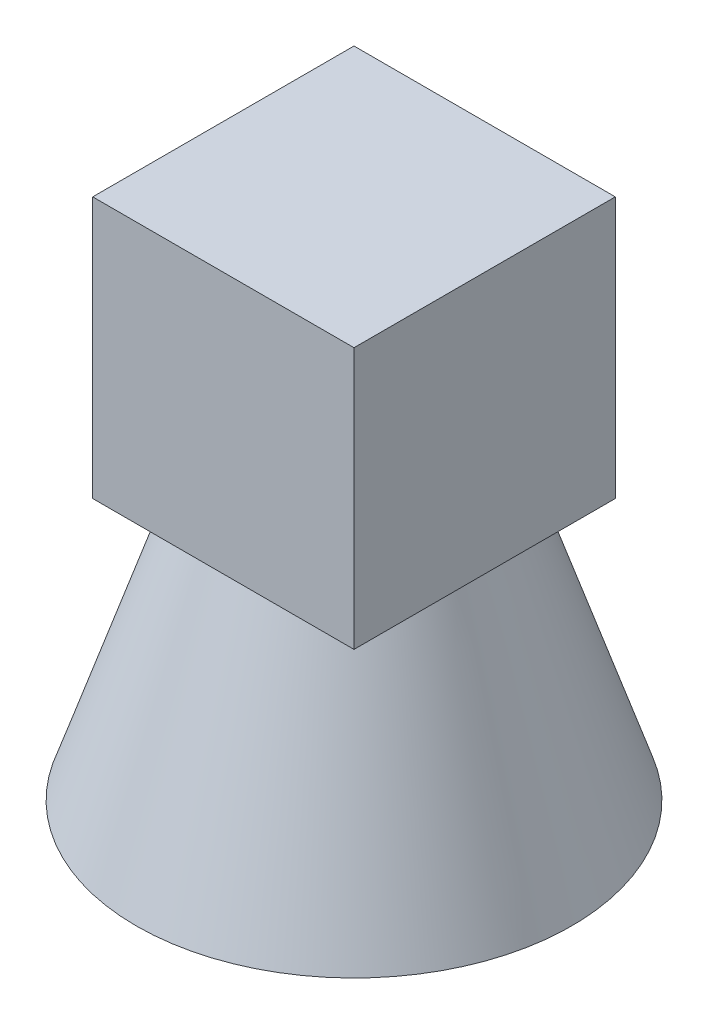
ISO-10303-21;
HEADER;
FILE_DESCRIPTION(('STEP AP214'),'2;1');
FILE_NAME('part.step','',(''),(''),'','','');
FILE_SCHEMA(('AUTOMOTIVE_DESIGN { 1 0 10303 214 1 1 1 1 }'));
ENDSEC;
DATA;
#1=APPLICATION_CONTEXT('core data for automotive mechanical design processes');
#2=APPLICATION_PROTOCOL_DEFINITION('international standard','automotive_design',2000,#1);
#3=PRODUCT_CONTEXT('',#1,'mechanical');
#4=PRODUCT('Part','Part','',(#3));
#5=PRODUCT_RELATED_PRODUCT_CATEGORY('part','',(#4));
#6=PRODUCT_DEFINITION_FORMATION('','',#4);
#7=PRODUCT_DEFINITION_CONTEXT('part definition',#1,'design');
#8=PRODUCT_DEFINITION('design','',#6,#7);
#9=PRODUCT_DEFINITION_SHAPE('','',#8);
#10=(LENGTH_UNIT() NAMED_UNIT(*) SI_UNIT(.MILLI.,.METRE.));
#11=(NAMED_UNIT(*) PLANE_ANGLE_UNIT() SI_UNIT($,.RADIAN.));
#12=(NAMED_UNIT(*) SI_UNIT($,.STERADIAN.) SOLID_ANGLE_UNIT());
#13=UNCERTAINTY_MEASURE_WITH_UNIT(LENGTH_MEASURE(1.E-05),#10,'distance_accuracy_value','');
#14=(GEOMETRIC_REPRESENTATION_CONTEXT(3) GLOBAL_UNCERTAINTY_ASSIGNED_CONTEXT((#13)) GLOBAL_UNIT_ASSIGNED_CONTEXT((#10,
#11,#12)) REPRESENTATION_CONTEXT('',''));
#15=CARTESIAN_POINT('',(0.,0.,0.));
#16=DIRECTION('',(0.,0.,1.));
#17=DIRECTION('',(1.,0.,0.));
#18=AXIS2_PLACEMENT_3D('',#15,#16,#17);
#19=CARTESIAN_POINT('',(0.,0.,0.));
#20=DIRECTION('',(0.,-1.,0.));
#21=DIRECTION('',(0.,0.,-1.));
#22=AXIS2_PLACEMENT_3D('',#19,#20,#21);
#23=PLANE('',#22);
#24=CARTESIAN_POINT('',(0.,0.,0.));
#25=DIRECTION('',(0.,-1.,0.));
#26=DIRECTION('',(0.,0.,-1.));
#27=AXIS2_PLACEMENT_3D('',#24,#25,#26);
#28=CIRCLE('',#27,15.);
#29=CARTESIAN_POINT('',(0.,0.,-15.));
#30=VERTEX_POINT('',#29);
#31=CARTESIAN_POINT('',(15.,0.,0.));
#32=VERTEX_POINT('',#31);
#33=EDGE_CURVE('E55',#30,#32,#28,.T.);
#34=ORIENTED_EDGE('',*,*,#33,.F.);
#35=DIRECTION('',(-1.,0.,0.));
#36=VECTOR('',#35,1.);
#37=CARTESIAN_POINT('',(-15.,0.,-15.));
#38=LINE('',#37,#36);
#39=CARTESIAN_POINT('',(15.,0.,-15.));
#40=VERTEX_POINT('',#39);
#41=EDGE_CURVE('E102',#40,#30,#38,.T.);
#42=ORIENTED_EDGE('',*,*,#41,.F.);
#43=DIRECTION('',(0.,0.,-1.));
#44=VECTOR('',#43,1.);
#45=CARTESIAN_POINT('',(15.,0.,15.));
#46=LINE('',#45,#44);
#47=EDGE_CURVE('E120',#32,#40,#46,.T.);
#48=ORIENTED_EDGE('',*,*,#47,.F.);
#49=EDGE_LOOP('',(#34,#42,#48));
#50=FACE_BOUND('',#49,.T.);
#51=ADVANCED_FACE('F43',(#50),#23,.T.);
#52=CARTESIAN_POINT('',(0.,0.,15.));
#53=VERTEX_POINT('',#52);
#54=EDGE_CURVE('E11',#32,#53,#28,.T.);
#55=ORIENTED_EDGE('',*,*,#54,.F.);
#56=CARTESIAN_POINT('',(15.,0.,15.));
#57=VERTEX_POINT('',#56);
#58=EDGE_CURVE('E118',#57,#32,#46,.T.);
#59=ORIENTED_EDGE('',*,*,#58,.F.);
#60=DIRECTION('',(1.,0.,0.));
#61=VECTOR('',#60,1.);
#62=CARTESIAN_POINT('',(-15.,0.,15.));
#63=LINE('',#62,#61);
#64=EDGE_CURVE('E152',#53,#57,#63,.T.);
#65=ORIENTED_EDGE('',*,*,#64,.F.);
#66=EDGE_LOOP('',(#55,#59,#65));
#67=FACE_BOUND('',#66,.T.);
#68=ADVANCED_FACE('F191',(#67),#23,.T.);
#69=CARTESIAN_POINT('',(-15.,0.,0.));
#70=VERTEX_POINT('',#69);
#71=EDGE_CURVE('E53',#53,#70,#28,.T.);
#72=ORIENTED_EDGE('',*,*,#71,.F.);
#73=CARTESIAN_POINT('',(-15.,0.,15.));
#74=VERTEX_POINT('',#73);
#75=EDGE_CURVE('E138',#74,#53,#63,.T.);
#76=ORIENTED_EDGE('',*,*,#75,.F.);
#77=DIRECTION('',(0.,0.,1.));
#78=VECTOR('',#77,1.);
#79=CARTESIAN_POINT('',(-15.,0.,15.));
#80=LINE('',#79,#78);
#81=EDGE_CURVE('E112',#70,#74,#80,.T.);
#82=ORIENTED_EDGE('',*,*,#81,.F.);
#83=EDGE_LOOP('',(#72,#76,#82));
#84=FACE_BOUND('',#83,.T.);
#85=ADVANCED_FACE('F188',(#84),#23,.T.);
#86=CARTESIAN_POINT('',(15.,30.,15.));
#87=DIRECTION('',(-1.,0.,0.));
#88=DIRECTION('',(0.,0.,1.));
#89=AXIS2_PLACEMENT_3D('',#86,#87,#88);
#90=PLANE('',#89);
#91=ORIENTED_EDGE('',*,*,#58,.T.);
#92=ORIENTED_EDGE('',*,*,#47,.T.);
#93=DIRECTION('',(0.,-1.,0.));
#94=VECTOR('',#93,1.);
#95=CARTESIAN_POINT('',(15.,30.,-15.));
#96=LINE('',#95,#94);
#97=CARTESIAN_POINT('',(15.,30.,-15.));
#98=VERTEX_POINT('',#97);
#99=EDGE_CURVE('E47',#98,#40,#96,.T.);
#100=ORIENTED_EDGE('',*,*,#99,.F.);
#101=DIRECTION('',(0.,0.,-1.));
#102=VECTOR('',#101,1.);
#103=CARTESIAN_POINT('',(15.,30.,15.));
#104=LINE('',#103,#102);
#105=CARTESIAN_POINT('',(15.,30.,15.));
#106=VERTEX_POINT('',#105);
#107=EDGE_CURVE('E133',#106,#98,#104,.T.);
#108=ORIENTED_EDGE('',*,*,#107,.F.);
#109=DIRECTION('',(0.,-1.,0.));
#110=VECTOR('',#109,1.);
#111=CARTESIAN_POINT('',(15.,30.,15.));
#112=LINE('',#111,#110);
#113=EDGE_CURVE('E147',#106,#57,#112,.T.);
#114=ORIENTED_EDGE('',*,*,#113,.T.);
#115=EDGE_LOOP('',(#91,#92,#100,#108,#114));
#116=FACE_BOUND('',#115,.T.);
#117=ADVANCED_FACE('F45',(#116),#90,.F.);
#118=CARTESIAN_POINT('',(-15.,30.,-15.));
#119=DIRECTION('',(0.,0.,1.));
#120=DIRECTION('',(1.,0.,0.));
#121=AXIS2_PLACEMENT_3D('',#118,#119,#120);
#122=PLANE('',#121);
#123=ORIENTED_EDGE('',*,*,#41,.T.);
#124=CARTESIAN_POINT('',(-15.,0.,-15.));
#125=VERTEX_POINT('',#124);
#126=EDGE_CURVE('E105',#30,#125,#38,.T.);
#127=ORIENTED_EDGE('',*,*,#126,.T.);
#128=DIRECTION('',(0.,-1.,0.));
#129=VECTOR('',#128,1.);
#130=CARTESIAN_POINT('',(-15.,30.,-15.));
#131=LINE('',#130,#129);
#132=CARTESIAN_POINT('',(-15.,30.,-15.));
#133=VERTEX_POINT('',#132);
#134=EDGE_CURVE('E130',#133,#125,#131,.T.);
#135=ORIENTED_EDGE('',*,*,#134,.F.);
#136=DIRECTION('',(-1.,0.,0.));
#137=VECTOR('',#136,1.);
#138=CARTESIAN_POINT('',(-15.,30.,-15.));
#139=LINE('',#138,#137);
#140=EDGE_CURVE('E137',#98,#133,#139,.T.);
#141=ORIENTED_EDGE('',*,*,#140,.F.);
#142=ORIENTED_EDGE('',*,*,#99,.T.);
#143=EDGE_LOOP('',(#123,#127,#135,#141,#142));
#144=FACE_BOUND('',#143,.T.);
#145=ADVANCED_FACE('F103',(#144),#122,.F.);
#146=CARTESIAN_POINT('',(-15.,30.,15.));
#147=DIRECTION('',(1.,0.,0.));
#148=DIRECTION('',(0.,0.,-1.));
#149=AXIS2_PLACEMENT_3D('',#146,#147,#148);
#150=PLANE('',#149);
#151=EDGE_CURVE('E116',#125,#70,#80,.T.);
#152=ORIENTED_EDGE('',*,*,#151,.T.);
#153=ORIENTED_EDGE('',*,*,#81,.T.);
#154=DIRECTION('',(0.,-1.,0.));
#155=VECTOR('',#154,1.);
#156=CARTESIAN_POINT('',(-15.,30.,15.));
#157=LINE('',#156,#155);
#158=CARTESIAN_POINT('',(-15.,30.,15.));
#159=VERTEX_POINT('',#158);
#160=EDGE_CURVE('E159',#159,#74,#157,.T.);
#161=ORIENTED_EDGE('',*,*,#160,.F.);
#162=DIRECTION('',(0.,0.,1.));
#163=VECTOR('',#162,1.);
#164=CARTESIAN_POINT('',(-15.,30.,15.));
#165=LINE('',#164,#163);
#166=EDGE_CURVE('E141',#133,#159,#165,.T.);
#167=ORIENTED_EDGE('',*,*,#166,.F.);
#168=ORIENTED_EDGE('',*,*,#134,.T.);
#169=EDGE_LOOP('',(#152,#153,#161,#167,#168));
#170=FACE_BOUND('',#169,.T.);
#171=ADVANCED_FACE('F165',(#170),#150,.F.);
#172=CARTESIAN_POINT('',(-15.,30.,15.));
#173=DIRECTION('',(0.,0.,-1.));
#174=DIRECTION('',(-1.,0.,0.));
#175=AXIS2_PLACEMENT_3D('',#172,#173,#174);
#176=PLANE('',#175);
#177=ORIENTED_EDGE('',*,*,#75,.T.);
#178=ORIENTED_EDGE('',*,*,#64,.T.);
#179=ORIENTED_EDGE('',*,*,#113,.F.);
#180=DIRECTION('',(1.,0.,0.));
#181=VECTOR('',#180,1.);
#182=CARTESIAN_POINT('',(-15.,30.,15.));
#183=LINE('',#182,#181);
#184=EDGE_CURVE('E144',#159,#106,#183,.T.);
#185=ORIENTED_EDGE('',*,*,#184,.F.);
#186=ORIENTED_EDGE('',*,*,#160,.T.);
#187=EDGE_LOOP('',(#177,#178,#179,#185,#186));
#188=FACE_BOUND('',#187,.T.);
#189=ADVANCED_FACE('F197',(#188),#176,.F.);
#190=CARTESIAN_POINT('',(0.,30.,0.));
#191=DIRECTION('',(0.,-1.,0.));
#192=DIRECTION('',(0.,0.,-1.));
#193=AXIS2_PLACEMENT_3D('',#190,#191,#192);
#194=PLANE('',#193);
#195=ORIENTED_EDGE('',*,*,#107,.T.);
#196=ORIENTED_EDGE('',*,*,#140,.T.);
#197=ORIENTED_EDGE('',*,*,#166,.T.);
#198=ORIENTED_EDGE('',*,*,#184,.T.);
#199=EDGE_LOOP('',(#195,#196,#197,#198));
#200=FACE_BOUND('',#199,.T.);
#201=ADVANCED_FACE('F169',(#200),#194,.F.);
#202=EDGE_CURVE('E62',#70,#30,#28,.T.);
#203=ORIENTED_EDGE('',*,*,#202,.F.);
#204=ORIENTED_EDGE('',*,*,#151,.F.);
#205=ORIENTED_EDGE('',*,*,#126,.F.);
#206=EDGE_LOOP('',(#203,#204,#205));
#207=FACE_BOUND('',#206,.T.);
#208=ADVANCED_FACE('F114',(#207),#23,.T.);
#209=CARTESIAN_POINT('',(0.,-30.,0.));
#210=DIRECTION('',(0.,-1.,0.));
#211=DIRECTION('',(0.,0.,-1.));
#212=AXIS2_PLACEMENT_3D('',#209,#210,#211);
#213=CONICAL_SURFACE('',#212,25.,0.321750554396642);
#214=ORIENTED_EDGE('',*,*,#33,.T.);
#215=ORIENTED_EDGE('',*,*,#54,.T.);
#216=ORIENTED_EDGE('',*,*,#71,.T.);
#217=ORIENTED_EDGE('',*,*,#202,.T.);
#218=EDGE_LOOP('',(#214,#215,#216,#217));
#219=FACE_BOUND('',#218,.T.);
#220=CARTESIAN_POINT('',(0.,-30.,0.));
#221=DIRECTION('',(0.,-1.,0.));
#222=DIRECTION('',(0.,0.,-1.));
#223=AXIS2_PLACEMENT_3D('',#220,#221,#222);
#224=CIRCLE('',#223,25.);
#225=CARTESIAN_POINT('',(0.,-30.,-25.));
#226=VERTEX_POINT('',#225);
#227=EDGE_CURVE('E124',#226,#226,#224,.T.);
#228=ORIENTED_EDGE('',*,*,#227,.F.);
#229=EDGE_LOOP('',(#228));
#230=FACE_BOUND('',#229,.T.);
#231=ADVANCED_FACE('F125',(#219,#230),#213,.T.);
#232=CARTESIAN_POINT('',(25.,-30.,0.));
#233=DIRECTION('',(0.,-1.,0.));
#234=DIRECTION('',(0.,0.,-1.));
#235=AXIS2_PLACEMENT_3D('',#232,#233,#234);
#236=PLANE('',#235);
#237=ORIENTED_EDGE('',*,*,#227,.T.);
#238=EDGE_LOOP('',(#237));
#239=FACE_BOUND('',#238,.T.);
#240=ADVANCED_FACE('F179',(#239),#236,.T.);
#241=CLOSED_SHELL('',(#51,#68,#85,#117,#145,#171,#189,#201,#208,#231,#240));
#242=MANIFOLD_SOLID_BREP('B2',#241);
#243=ADVANCED_BREP_SHAPE_REPRESENTATION('',(#18,#242),#14);
#244=SHAPE_DEFINITION_REPRESENTATION(#9,#243);
ENDSEC;
END-ISO-10303-21;
